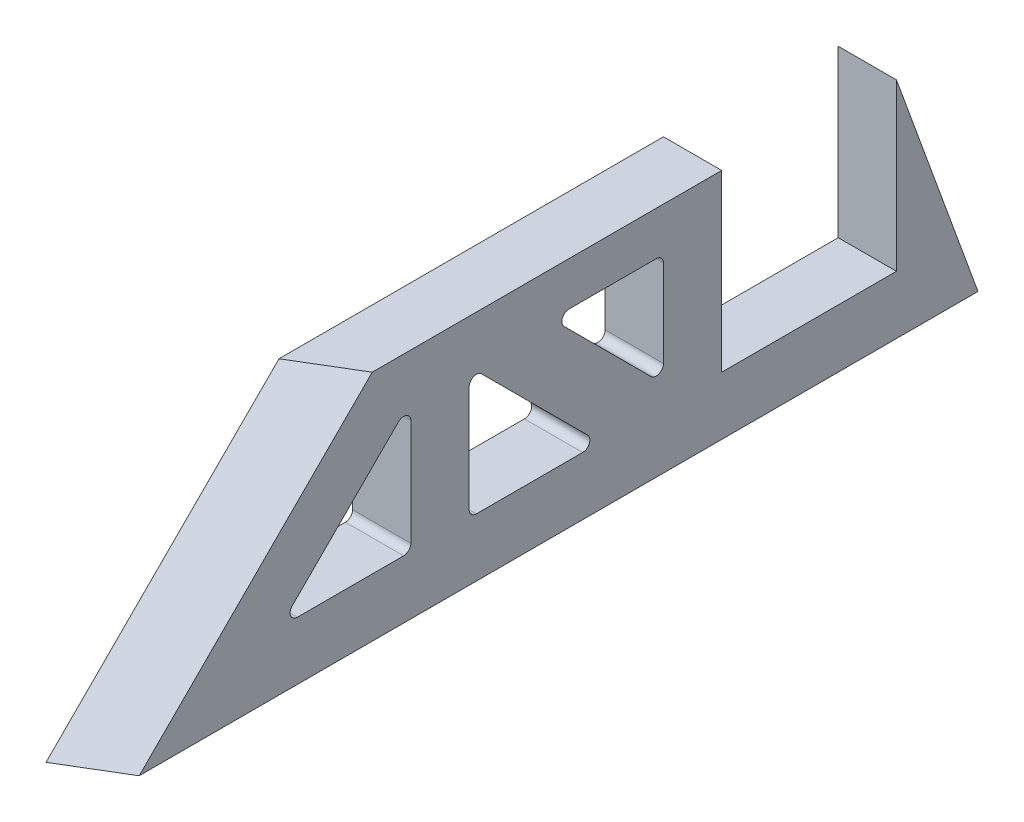
ISO-10303-21;
HEADER;
FILE_DESCRIPTION(('STEP AP214'),'2;1');
FILE_NAME('part.step','',(''),(''),'','','');
FILE_SCHEMA(('AUTOMOTIVE_DESIGN { 1 0 10303 214 1 1 1 1 }'));
ENDSEC;
DATA;
#1=APPLICATION_CONTEXT('core data for automotive mechanical design processes');
#2=APPLICATION_PROTOCOL_DEFINITION('international standard','automotive_design',2000,#1);
#3=PRODUCT_CONTEXT('',#1,'mechanical');
#4=PRODUCT('Part','Part','',(#3));
#5=PRODUCT_RELATED_PRODUCT_CATEGORY('part','',(#4));
#6=PRODUCT_DEFINITION_FORMATION('','',#4);
#7=PRODUCT_DEFINITION_CONTEXT('part definition',#1,'design');
#8=PRODUCT_DEFINITION('design','',#6,#7);
#9=PRODUCT_DEFINITION_SHAPE('','',#8);
#10=(LENGTH_UNIT() NAMED_UNIT(*) SI_UNIT(.MILLI.,.METRE.));
#11=(NAMED_UNIT(*) PLANE_ANGLE_UNIT() SI_UNIT($,.RADIAN.));
#12=(NAMED_UNIT(*) SI_UNIT($,.STERADIAN.) SOLID_ANGLE_UNIT());
#13=UNCERTAINTY_MEASURE_WITH_UNIT(LENGTH_MEASURE(1.E-05),#10,'distance_accuracy_value','');
#14=(GEOMETRIC_REPRESENTATION_CONTEXT(3) GLOBAL_UNCERTAINTY_ASSIGNED_CONTEXT((#13)) GLOBAL_UNIT_ASSIGNED_CONTEXT((#10,
#11,#12)) REPRESENTATION_CONTEXT('',''));
#15=CARTESIAN_POINT('',(0.,0.,0.));
#16=DIRECTION('',(0.,0.,1.));
#17=DIRECTION('',(1.,0.,0.));
#18=AXIS2_PLACEMENT_3D('',#15,#16,#17);
#19=CARTESIAN_POINT('',(12.7,12.7,-39.37));
#20=DIRECTION('',(0.,0.,1.));
#21=DIRECTION('',(0.,-1.,0.));
#22=AXIS2_PLACEMENT_3D('',#19,#20,#21);
#23=PLANE('',#22);
#24=DIRECTION('',(0.,1.,0.));
#25=VECTOR('',#24,1.);
#26=CARTESIAN_POINT('',(0.,12.7,-39.37));
#27=LINE('',#26,#25);
#28=CARTESIAN_POINT('',(0.,12.7,-39.37));
#29=VERTEX_POINT('',#28);
#30=CARTESIAN_POINT('',(0.,50.8,-39.37));
#31=VERTEX_POINT('',#30);
#32=EDGE_CURVE('E237',#29,#31,#27,.T.);
#33=ORIENTED_EDGE('',*,*,#32,.T.);
#34=DIRECTION('',(-1.,0.,0.));
#35=VECTOR('',#34,1.);
#36=CARTESIAN_POINT('',(12.7,50.8,-39.37));
#37=LINE('',#36,#35);
#38=CARTESIAN_POINT('',(12.7,50.8,-39.37));
#39=VERTEX_POINT('',#38);
#40=EDGE_CURVE('E261',#39,#31,#37,.T.);
#41=ORIENTED_EDGE('',*,*,#40,.F.);
#42=DIRECTION('',(0.,1.,0.));
#43=VECTOR('',#42,1.);
#44=CARTESIAN_POINT('',(12.7,12.7,-39.37));
#45=LINE('',#44,#43);
#46=CARTESIAN_POINT('',(12.7,12.7,-39.37));
#47=VERTEX_POINT('',#46);
#48=EDGE_CURVE('E229',#47,#39,#45,.T.);
#49=ORIENTED_EDGE('',*,*,#48,.F.);
#50=DIRECTION('',(-1.,0.,0.));
#51=VECTOR('',#50,1.);
#52=CARTESIAN_POINT('',(12.7,12.7,-39.37));
#53=LINE('',#52,#51);
#54=EDGE_CURVE('E236',#47,#29,#53,.T.);
#55=ORIENTED_EDGE('',*,*,#54,.T.);
#56=EDGE_LOOP('',(#33,#41,#49,#55));
#57=FACE_BOUND('',#56,.T.);
#58=ADVANCED_FACE('F33',(#57),#23,.F.);
#59=CARTESIAN_POINT('',(12.7,50.8,-39.37));
#60=DIRECTION('',(0.,-1.,0.));
#61=DIRECTION('',(0.,0.,-1.));
#62=AXIS2_PLACEMENT_3D('',#59,#60,#61);
#63=PLANE('',#62);
#64=DIRECTION('',(0.,0.,1.));
#65=VECTOR('',#64,1.);
#66=CARTESIAN_POINT('',(0.,50.8,-39.37));
#67=LINE('',#66,#65);
#68=CARTESIAN_POINT('',(0.,50.8,44.4499999999995));
#69=VERTEX_POINT('',#68);
#70=EDGE_CURVE('E240',#31,#69,#67,.T.);
#71=ORIENTED_EDGE('',*,*,#70,.T.);
#72=DIRECTION('',(0.857492925712544,0.,-0.514495755427527));
#73=VECTOR('',#72,1.);
#74=CARTESIAN_POINT('',(46.3176470588233,50.8,16.6594117647055));
#75=LINE('',#74,#73);
#76=CARTESIAN_POINT('',(12.7,50.8,36.8299999999995));
#77=VERTEX_POINT('',#76);
#78=EDGE_CURVE('E219',#69,#77,#75,.T.);
#79=ORIENTED_EDGE('',*,*,#78,.T.);
#80=DIRECTION('',(0.,0.,1.));
#81=VECTOR('',#80,1.);
#82=CARTESIAN_POINT('',(12.7,50.8,-39.37));
#83=LINE('',#82,#81);
#84=EDGE_CURVE('E218',#39,#77,#83,.T.);
#85=ORIENTED_EDGE('',*,*,#84,.F.);
#86=ORIENTED_EDGE('',*,*,#40,.T.);
#87=EDGE_LOOP('',(#71,#79,#85,#86));
#88=FACE_BOUND('',#87,.T.);
#89=ADVANCED_FACE('F389',(#88),#63,.F.);
#90=CARTESIAN_POINT('',(12.7,0.,95.25));
#91=DIRECTION('',(0.,1.,0.));
#92=DIRECTION('',(0.,0.,1.));
#93=AXIS2_PLACEMENT_3D('',#90,#91,#92);
#94=PLANE('',#93);
#95=DIRECTION('',(0.,0.,-1.));
#96=VECTOR('',#95,1.);
#97=CARTESIAN_POINT('',(12.7,0.,95.25));
#98=LINE('',#97,#96);
#99=CARTESIAN_POINT('',(12.7,0.,87.63));
#100=VERTEX_POINT('',#99);
#101=CARTESIAN_POINT('',(12.7,0.,-95.25));
#102=VERTEX_POINT('',#101);
#103=EDGE_CURVE('E215',#100,#102,#98,.T.);
#104=ORIENTED_EDGE('',*,*,#103,.F.);
#105=DIRECTION('',(0.857492925712544,0.,-0.514495755427527));
#106=VECTOR('',#105,1.);
#107=CARTESIAN_POINT('',(12.7,0.,87.63));
#108=LINE('',#107,#106);
#109=CARTESIAN_POINT('',(0.,0.,95.25));
#110=VERTEX_POINT('',#109);
#111=EDGE_CURVE('E200',#110,#100,#108,.T.);
#112=ORIENTED_EDGE('',*,*,#111,.F.);
#113=DIRECTION('',(0.,0.,-1.));
#114=VECTOR('',#113,1.);
#115=CARTESIAN_POINT('',(0.,0.,95.25));
#116=LINE('',#115,#114);
#117=CARTESIAN_POINT('',(0.,0.,-95.25));
#118=VERTEX_POINT('',#117);
#119=EDGE_CURVE('E244',#110,#118,#116,.T.);
#120=ORIENTED_EDGE('',*,*,#119,.T.);
#121=DIRECTION('',(-1.,0.,0.));
#122=VECTOR('',#121,1.);
#123=CARTESIAN_POINT('',(12.7,0.,-95.25));
#124=LINE('',#123,#122);
#125=EDGE_CURVE('E223',#102,#118,#124,.T.);
#126=ORIENTED_EDGE('',*,*,#125,.F.);
#127=EDGE_LOOP('',(#104,#112,#120,#126));
#128=FACE_BOUND('',#127,.T.);
#129=ADVANCED_FACE('F221',(#128),#94,.F.);
#130=CARTESIAN_POINT('',(12.7,0.,-95.25));
#131=DIRECTION('',(0.,-0.342020143325673,0.939692620785907));
#132=DIRECTION('',(0.,-0.939692620785907,-0.342020143325673));
#133=AXIS2_PLACEMENT_3D('',#130,#131,#132);
#134=PLANE('',#133);
#135=DIRECTION('',(0.,0.939692620785907,0.342020143325673));
#136=VECTOR('',#135,1.);
#137=CARTESIAN_POINT('',(0.,0.,-95.25));
#138=LINE('',#137,#136);
#139=CARTESIAN_POINT('',(0.,48.8501485179025,-77.47));
#140=VERTEX_POINT('',#139);
#141=EDGE_CURVE('E246',#118,#140,#138,.T.);
#142=ORIENTED_EDGE('',*,*,#141,.T.);
#143=DIRECTION('',(-1.,0.,0.));
#144=VECTOR('',#143,1.);
#145=CARTESIAN_POINT('',(12.7,48.8501485179025,-77.47));
#146=LINE('',#145,#144);
#147=CARTESIAN_POINT('',(12.7,48.8501485179025,-77.47));
#148=VERTEX_POINT('',#147);
#149=EDGE_CURVE('E257',#148,#140,#146,.T.);
#150=ORIENTED_EDGE('',*,*,#149,.F.);
#151=DIRECTION('',(0.,0.939692620785907,0.342020143325673));
#152=VECTOR('',#151,1.);
#153=CARTESIAN_POINT('',(12.7,0.,-95.25));
#154=LINE('',#153,#152);
#155=EDGE_CURVE('E225',#102,#148,#154,.T.);
#156=ORIENTED_EDGE('',*,*,#155,.F.);
#157=ORIENTED_EDGE('',*,*,#125,.T.);
#158=EDGE_LOOP('',(#142,#150,#156,#157));
#159=FACE_BOUND('',#158,.T.);
#160=ADVANCED_FACE('F393',(#159),#134,.F.);
#161=CARTESIAN_POINT('',(12.7,48.8501485179025,-77.47));
#162=DIRECTION('',(0.,0.,-1.));
#163=DIRECTION('',(-1.,0.,0.));
#164=AXIS2_PLACEMENT_3D('',#161,#162,#163);
#165=PLANE('',#164);
#166=DIRECTION('',(0.,-1.,0.));
#167=VECTOR('',#166,1.);
#168=CARTESIAN_POINT('',(0.,48.8501485179025,-77.47));
#169=LINE('',#168,#167);
#170=CARTESIAN_POINT('',(0.,12.7,-77.47));
#171=VERTEX_POINT('',#170);
#172=EDGE_CURVE('E248',#140,#171,#169,.T.);
#173=ORIENTED_EDGE('',*,*,#172,.T.);
#174=DIRECTION('',(-1.,0.,0.));
#175=VECTOR('',#174,1.);
#176=CARTESIAN_POINT('',(12.7,12.7,-77.47));
#177=LINE('',#176,#175);
#178=CARTESIAN_POINT('',(12.7,12.7,-77.47));
#179=VERTEX_POINT('',#178);
#180=EDGE_CURVE('E254',#179,#171,#177,.T.);
#181=ORIENTED_EDGE('',*,*,#180,.F.);
#182=DIRECTION('',(0.,-1.,0.));
#183=VECTOR('',#182,1.);
#184=CARTESIAN_POINT('',(12.7,48.8501485179025,-77.47));
#185=LINE('',#184,#183);
#186=EDGE_CURVE('E227',#148,#179,#185,.T.);
#187=ORIENTED_EDGE('',*,*,#186,.F.);
#188=ORIENTED_EDGE('',*,*,#149,.T.);
#189=EDGE_LOOP('',(#173,#181,#187,#188));
#190=FACE_BOUND('',#189,.T.);
#191=ADVANCED_FACE('F398',(#190),#165,.F.);
#192=CARTESIAN_POINT('',(12.7,12.7,-77.47));
#193=DIRECTION('',(0.,-1.,0.));
#194=DIRECTION('',(0.,0.,-1.));
#195=AXIS2_PLACEMENT_3D('',#192,#193,#194);
#196=PLANE('',#195);
#197=DIRECTION('',(0.,0.,1.));
#198=VECTOR('',#197,1.);
#199=CARTESIAN_POINT('',(0.,12.7,-77.47));
#200=LINE('',#199,#198);
#201=EDGE_CURVE('E250',#171,#29,#200,.T.);
#202=ORIENTED_EDGE('',*,*,#201,.T.);
#203=ORIENTED_EDGE('',*,*,#54,.F.);
#204=DIRECTION('',(0.,0.,1.));
#205=VECTOR('',#204,1.);
#206=CARTESIAN_POINT('',(12.7,12.7,-77.47));
#207=LINE('',#206,#205);
#208=EDGE_CURVE('E234',#179,#47,#207,.T.);
#209=ORIENTED_EDGE('',*,*,#208,.F.);
#210=ORIENTED_EDGE('',*,*,#180,.T.);
#211=EDGE_LOOP('',(#202,#203,#209,#210));
#212=FACE_BOUND('',#211,.T.);
#213=ADVANCED_FACE('F401',(#212),#196,.F.);
#214=CARTESIAN_POINT('',(12.7,0.,0.));
#215=DIRECTION('',(1.,0.,0.));
#216=DIRECTION('',(0.,0.,-1.));
#217=AXIS2_PLACEMENT_3D('',#214,#215,#216);
#218=PLANE('',#217);
#219=DIRECTION('',(0.,0.,-1.));
#220=VECTOR('',#219,1.);
#221=CARTESIAN_POINT('',(12.7,12.7,28.3944877578612));
#222=LINE('',#221,#220);
#223=CARTESIAN_POINT('',(12.7,12.7,53.1369237275939));
#224=VERTEX_POINT('',#223);
#225=CARTESIAN_POINT('',(12.7,12.7,29.9819877578612));
#226=VERTEX_POINT('',#225);
#227=EDGE_CURVE('E472',#224,#226,#222,.T.);
#228=ORIENTED_EDGE('',*,*,#227,.F.);
#229=CARTESIAN_POINT('',(12.7,14.2875,53.1369237275939));
#230=DIRECTION('',(1.,0.,0.));
#231=DIRECTION('',(0.,0.,-1.));
#232=AXIS2_PLACEMENT_3D('',#229,#230,#231);
#233=CIRCLE('',#232,1.5875);
#234=CARTESIAN_POINT('',(12.7,15.4100320151336,54.2594557427275));
#235=VERTEX_POINT('',#234);
#236=EDGE_CURVE('E312',#224,#235,#233,.F.);
#237=ORIENTED_EDGE('',*,*,#236,.T.);
#238=DIRECTION('',(0.,-0.707106781186548,0.707106781186547));
#239=VECTOR('',#238,1.);
#240=CARTESIAN_POINT('',(12.7,12.7,56.9694877578612));
#241=LINE('',#240,#239);
#242=CARTESIAN_POINT('',(12.7,38.5649679848663,31.1045197729948));
#243=VERTEX_POINT('',#242);
#244=EDGE_CURVE('E480',#243,#235,#241,.T.);
#245=ORIENTED_EDGE('',*,*,#244,.F.);
#246=CARTESIAN_POINT('',(12.7,37.4424359697327,29.9819877578612));
#247=DIRECTION('',(1.,0.,0.));
#248=DIRECTION('',(0.,0.,-1.));
#249=AXIS2_PLACEMENT_3D('',#246,#247,#248);
#250=CIRCLE('',#249,1.5875);
#251=CARTESIAN_POINT('',(12.7,37.4424359697327,28.3944877578612));
#252=VERTEX_POINT('',#251);
#253=EDGE_CURVE('E334',#243,#252,#250,.F.);
#254=ORIENTED_EDGE('',*,*,#253,.T.);
#255=DIRECTION('',(0.,1.,0.));
#256=VECTOR('',#255,1.);
#257=CARTESIAN_POINT('',(12.7,41.275,28.3944877578612));
#258=LINE('',#257,#256);
#259=CARTESIAN_POINT('',(12.7,14.2875,28.3944877578612));
#260=VERTEX_POINT('',#259);
#261=EDGE_CURVE('E477',#260,#252,#258,.T.);
#262=ORIENTED_EDGE('',*,*,#261,.F.);
#263=CARTESIAN_POINT('',(12.7,14.2875,29.9819877578612));
#264=DIRECTION('',(1.,0.,0.));
#265=DIRECTION('',(0.,0.,-1.));
#266=AXIS2_PLACEMENT_3D('',#263,#264,#265);
#267=CIRCLE('',#266,1.5875);
#268=EDGE_CURVE('E320',#260,#226,#267,.F.);
#269=ORIENTED_EDGE('',*,*,#268,.T.);
#270=EDGE_LOOP('',(#228,#237,#245,#254,#262,#269));
#271=FACE_BOUND('',#270,.T.);
#272=DIRECTION('',(0.,0.,1.));
#273=VECTOR('',#272,1.);
#274=CARTESIAN_POINT('',(12.7,41.275,-26.67));
#275=LINE('',#274,#273);
#276=CARTESIAN_POINT('',(12.7,41.275,-25.0825));
#277=VERTEX_POINT('',#276);
#278=CARTESIAN_POINT('',(12.7,41.275,-6.09858851454442));
#279=VERTEX_POINT('',#278);
#280=EDGE_CURVE('E489',#277,#279,#275,.T.);
#281=ORIENTED_EDGE('',*,*,#280,.F.);
#282=CARTESIAN_POINT('',(12.7,39.6875,-25.0825));
#283=DIRECTION('',(1.,0.,0.));
#284=DIRECTION('',(0.,0.,-1.));
#285=AXIS2_PLACEMENT_3D('',#282,#283,#284);
#286=CIRCLE('',#285,1.5875);
#287=CARTESIAN_POINT('',(12.7,39.6875,-26.67));
#288=VERTEX_POINT('',#287);
#289=EDGE_CURVE('E56',#277,#288,#286,.F.);
#290=ORIENTED_EDGE('',*,*,#289,.T.);
#291=DIRECTION('',(0.,1.,0.));
#292=VECTOR('',#291,1.);
#293=CARTESIAN_POINT('',(12.7,16.8710244842771,-26.67));
#294=LINE('',#293,#292);
#295=CARTESIAN_POINT('',(12.7,20.7035885145444,-26.67));
#296=VERTEX_POINT('',#295);
#297=EDGE_CURVE('E373',#296,#288,#294,.T.);
#298=ORIENTED_EDGE('',*,*,#297,.F.);
#299=CARTESIAN_POINT('',(12.7,20.7035885145444,-25.0825));
#300=DIRECTION('',(1.,0.,0.));
#301=DIRECTION('',(0.,0.,-1.));
#302=AXIS2_PLACEMENT_3D('',#299,#300,#301);
#303=CIRCLE('',#302,1.5875);
#304=CARTESIAN_POINT('',(12.7,19.5810564994108,-23.9599679848664));
#305=VERTEX_POINT('',#304);
#306=EDGE_CURVE('E316',#296,#305,#303,.F.);
#307=ORIENTED_EDGE('',*,*,#306,.T.);
#308=DIRECTION('',(0.,-0.707106781186547,-0.707106781186547));
#309=VECTOR('',#308,1.);
#310=CARTESIAN_POINT('',(12.7,41.275,-2.26602448427713));
#311=LINE('',#310,#309);
#312=CARTESIAN_POINT('',(12.7,38.5649679848664,-4.97605649941077));
#313=VERTEX_POINT('',#312);
#314=EDGE_CURVE('E491',#313,#305,#311,.T.);
#315=ORIENTED_EDGE('',*,*,#314,.F.);
#316=CARTESIAN_POINT('',(12.7,39.6875,-6.09858851454442));
#317=DIRECTION('',(1.,0.,0.));
#318=DIRECTION('',(0.,0.,-1.));
#319=AXIS2_PLACEMENT_3D('',#316,#317,#318);
#320=CIRCLE('',#319,1.5875);
#321=EDGE_CURVE('E48',#313,#279,#320,.F.);
#322=ORIENTED_EDGE('',*,*,#321,.T.);
#323=EDGE_LOOP('',(#281,#290,#298,#307,#315,#322));
#324=FACE_BOUND('',#323,.T.);
#325=DIRECTION('',(0.,0.,-1.));
#326=VECTOR('',#325,1.);
#327=CARTESIAN_POINT('',(12.7,12.7,-12.8805122421389));
#328=LINE('',#327,#326);
#329=CARTESIAN_POINT('',(12.7,12.7,14.1069877578612));
#330=VERTEX_POINT('',#329);
#331=CARTESIAN_POINT('',(12.7,12.7,-9.04794821187155));
#332=VERTEX_POINT('',#331);
#333=EDGE_CURVE('E353',#330,#332,#328,.T.);
#334=ORIENTED_EDGE('',*,*,#333,.F.);
#335=CARTESIAN_POINT('',(12.7,14.2875,14.1069877578612));
#336=DIRECTION('',(1.,0.,0.));
#337=DIRECTION('',(0.,0.,-1.));
#338=AXIS2_PLACEMENT_3D('',#335,#336,#337);
#339=CIRCLE('',#338,1.5875);
#340=CARTESIAN_POINT('',(12.7,14.2875,15.6944877578612));
#341=VERTEX_POINT('',#340);
#342=EDGE_CURVE('E308',#330,#341,#339,.F.);
#343=ORIENTED_EDGE('',*,*,#342,.T.);
#344=DIRECTION('',(0.,-1.,0.));
#345=VECTOR('',#344,1.);
#346=CARTESIAN_POINT('',(12.7,12.7,15.6944877578612));
#347=LINE('',#346,#345);
#348=CARTESIAN_POINT('',(12.7,37.4424359697327,15.6944877578612));
#349=VERTEX_POINT('',#348);
#350=EDGE_CURVE('E344',#349,#341,#347,.T.);
#351=ORIENTED_EDGE('',*,*,#350,.F.);
#352=CARTESIAN_POINT('',(12.7,37.4424359697327,14.1069877578612));
#353=DIRECTION('',(1.,0.,0.));
#354=DIRECTION('',(0.,0.,-1.));
#355=AXIS2_PLACEMENT_3D('',#352,#353,#354);
#356=CIRCLE('',#355,1.5875);
#357=CARTESIAN_POINT('',(12.7,38.5649679848663,12.9844557427275));
#358=VERTEX_POINT('',#357);
#359=EDGE_CURVE('E41',#349,#358,#356,.F.);
#360=ORIENTED_EDGE('',*,*,#359,.T.);
#361=DIRECTION('',(0.,0.707106781186547,0.707106781186548));
#362=VECTOR('',#361,1.);
#363=CARTESIAN_POINT('',(12.7,41.275,15.6944877578612));
#364=LINE('',#363,#362);
#365=CARTESIAN_POINT('',(12.7,15.4100320151336,-10.1704802270052));
#366=VERTEX_POINT('',#365);
#367=EDGE_CURVE('E342',#366,#358,#364,.T.);
#368=ORIENTED_EDGE('',*,*,#367,.F.);
#369=CARTESIAN_POINT('',(12.7,14.2875,-9.04794821187155));
#370=DIRECTION('',(1.,0.,0.));
#371=DIRECTION('',(0.,0.,-1.));
#372=AXIS2_PLACEMENT_3D('',#369,#370,#371);
#373=CIRCLE('',#372,1.5875);
#374=EDGE_CURVE('E324',#366,#332,#373,.F.);
#375=ORIENTED_EDGE('',*,*,#374,.T.);
#376=EDGE_LOOP('',(#334,#343,#351,#360,#368,#375));
#377=FACE_BOUND('',#376,.T.);
#378=DIRECTION('',(0.,-0.707106781186544,0.707106781186551));
#379=VECTOR('',#378,1.);
#380=CARTESIAN_POINT('',(12.7,120.65,-33.020000000001));
#381=LINE('',#380,#379);
#382=EDGE_CURVE('E203',#77,#100,#381,.T.);
#383=ORIENTED_EDGE('',*,*,#382,.T.);
#384=ORIENTED_EDGE('',*,*,#103,.T.);
#385=ORIENTED_EDGE('',*,*,#155,.T.);
#386=ORIENTED_EDGE('',*,*,#186,.T.);
#387=ORIENTED_EDGE('',*,*,#208,.T.);
#388=ORIENTED_EDGE('',*,*,#48,.T.);
#389=ORIENTED_EDGE('',*,*,#84,.T.);
#390=EDGE_LOOP('',(#383,#384,#385,#386,#387,#388,#389));
#391=FACE_BOUND('',#390,.T.);
#392=ADVANCED_FACE('F214',(#271,#324,#377,#391),#218,.T.);
#393=CARTESIAN_POINT('',(0.,0.,0.));
#394=DIRECTION('',(1.,0.,0.));
#395=DIRECTION('',(0.,0.,-1.));
#396=AXIS2_PLACEMENT_3D('',#393,#394,#395);
#397=PLANE('',#396);
#398=DIRECTION('',(0.,0.707106781186548,-0.707106781186548));
#399=VECTOR('',#398,1.);
#400=CARTESIAN_POINT('',(0.,12.7,56.9694877578612));
#401=LINE('',#400,#399);
#402=CARTESIAN_POINT('',(0.,15.4100320151336,54.2594557427275));
#403=VERTEX_POINT('',#402);
#404=CARTESIAN_POINT('',(0.,38.5649679848663,31.1045197729948));
#405=VERTEX_POINT('',#404);
#406=EDGE_CURVE('E380',#403,#405,#401,.T.);
#407=ORIENTED_EDGE('',*,*,#406,.F.);
#408=CARTESIAN_POINT('',(0.,14.2875,53.1369237275939));
#409=DIRECTION('',(1.,0.,0.));
#410=DIRECTION('',(0.,0.,-1.));
#411=AXIS2_PLACEMENT_3D('',#408,#409,#410);
#412=CIRCLE('',#411,1.5875);
#413=CARTESIAN_POINT('',(0.,12.7,53.1369237275939));
#414=VERTEX_POINT('',#413);
#415=EDGE_CURVE('E314',#403,#414,#412,.T.);
#416=ORIENTED_EDGE('',*,*,#415,.T.);
#417=DIRECTION('',(0.,0.,1.));
#418=VECTOR('',#417,1.);
#419=CARTESIAN_POINT('',(0.,12.7,28.3944877578612));
#420=LINE('',#419,#418);
#421=CARTESIAN_POINT('',(0.,12.7,29.9819877578612));
#422=VERTEX_POINT('',#421);
#423=EDGE_CURVE('E469',#422,#414,#420,.T.);
#424=ORIENTED_EDGE('',*,*,#423,.F.);
#425=CARTESIAN_POINT('',(0.,14.2875,29.9819877578612));
#426=DIRECTION('',(1.,0.,0.));
#427=DIRECTION('',(0.,0.,-1.));
#428=AXIS2_PLACEMENT_3D('',#425,#426,#427);
#429=CIRCLE('',#428,1.5875);
#430=CARTESIAN_POINT('',(0.,14.2875,28.3944877578612));
#431=VERTEX_POINT('',#430);
#432=EDGE_CURVE('E322',#422,#431,#429,.T.);
#433=ORIENTED_EDGE('',*,*,#432,.T.);
#434=DIRECTION('',(0.,-1.,0.));
#435=VECTOR('',#434,1.);
#436=CARTESIAN_POINT('',(0.,41.275,28.3944877578612));
#437=LINE('',#436,#435);
#438=CARTESIAN_POINT('',(0.,37.4424359697327,28.3944877578612));
#439=VERTEX_POINT('',#438);
#440=EDGE_CURVE('E210',#439,#431,#437,.T.);
#441=ORIENTED_EDGE('',*,*,#440,.F.);
#442=CARTESIAN_POINT('',(0.,37.4424359697327,29.9819877578612));
#443=DIRECTION('',(1.,0.,0.));
#444=DIRECTION('',(0.,0.,-1.));
#445=AXIS2_PLACEMENT_3D('',#442,#443,#444);
#446=CIRCLE('',#445,1.5875);
#447=EDGE_CURVE('E336',#439,#405,#446,.T.);
#448=ORIENTED_EDGE('',*,*,#447,.T.);
#449=EDGE_LOOP('',(#407,#416,#424,#433,#441,#448));
#450=FACE_BOUND('',#449,.T.);
#451=DIRECTION('',(0.,-1.,0.));
#452=VECTOR('',#451,1.);
#453=CARTESIAN_POINT('',(0.,16.8710244842771,-26.67));
#454=LINE('',#453,#452);
#455=CARTESIAN_POINT('',(0.,39.6875,-26.67));
#456=VERTEX_POINT('',#455);
#457=CARTESIAN_POINT('',(0.,20.7035885145444,-26.67));
#458=VERTEX_POINT('',#457);
#459=EDGE_CURVE('E483',#456,#458,#454,.T.);
#460=ORIENTED_EDGE('',*,*,#459,.F.);
#461=CARTESIAN_POINT('',(0.,39.6875,-25.0825));
#462=DIRECTION('',(1.,0.,0.));
#463=DIRECTION('',(0.,0.,-1.));
#464=AXIS2_PLACEMENT_3D('',#461,#462,#463);
#465=CIRCLE('',#464,1.5875);
#466=CARTESIAN_POINT('',(0.,41.275,-25.0825));
#467=VERTEX_POINT('',#466);
#468=EDGE_CURVE('E332',#456,#467,#465,.T.);
#469=ORIENTED_EDGE('',*,*,#468,.T.);
#470=DIRECTION('',(0.,0.,-1.));
#471=VECTOR('',#470,1.);
#472=CARTESIAN_POINT('',(0.,41.275,-26.67));
#473=LINE('',#472,#471);
#474=CARTESIAN_POINT('',(0.,41.275,-6.09858851454442));
#475=VERTEX_POINT('',#474);
#476=EDGE_CURVE('E486',#475,#467,#473,.T.);
#477=ORIENTED_EDGE('',*,*,#476,.F.);
#478=CARTESIAN_POINT('',(0.,39.6875,-6.09858851454442));
#479=DIRECTION('',(1.,0.,0.));
#480=DIRECTION('',(0.,0.,-1.));
#481=AXIS2_PLACEMENT_3D('',#478,#479,#480);
#482=CIRCLE('',#481,1.5875);
#483=CARTESIAN_POINT('',(0.,38.5649679848664,-4.97605649941077));
#484=VERTEX_POINT('',#483);
#485=EDGE_CURVE('E329',#475,#484,#482,.T.);
#486=ORIENTED_EDGE('',*,*,#485,.T.);
#487=DIRECTION('',(0.,0.707106781186548,0.707106781186548));
#488=VECTOR('',#487,1.);
#489=CARTESIAN_POINT('',(0.,41.275,-2.26602448427713));
#490=LINE('',#489,#488);
#491=CARTESIAN_POINT('',(0.,19.5810564994108,-23.9599679848664));
#492=VERTEX_POINT('',#491);
#493=EDGE_CURVE('E368',#492,#484,#490,.T.);
#494=ORIENTED_EDGE('',*,*,#493,.F.);
#495=CARTESIAN_POINT('',(0.,20.7035885145444,-25.0825));
#496=DIRECTION('',(1.,0.,0.));
#497=DIRECTION('',(0.,0.,-1.));
#498=AXIS2_PLACEMENT_3D('',#495,#496,#497);
#499=CIRCLE('',#498,1.5875);
#500=EDGE_CURVE('E318',#492,#458,#499,.T.);
#501=ORIENTED_EDGE('',*,*,#500,.T.);
#502=EDGE_LOOP('',(#460,#469,#477,#486,#494,#501));
#503=FACE_BOUND('',#502,.T.);
#504=DIRECTION('',(0.,1.,0.));
#505=VECTOR('',#504,1.);
#506=CARTESIAN_POINT('',(0.,12.7,15.6944877578612));
#507=LINE('',#506,#505);
#508=CARTESIAN_POINT('',(0.,14.2875,15.6944877578612));
#509=VERTEX_POINT('',#508);
#510=CARTESIAN_POINT('',(0.,37.4424359697327,15.6944877578612));
#511=VERTEX_POINT('',#510);
#512=EDGE_CURVE('E361',#509,#511,#507,.T.);
#513=ORIENTED_EDGE('',*,*,#512,.F.);
#514=CARTESIAN_POINT('',(0.,14.2875,14.1069877578612));
#515=DIRECTION('',(1.,0.,0.));
#516=DIRECTION('',(0.,0.,-1.));
#517=AXIS2_PLACEMENT_3D('',#514,#515,#516);
#518=CIRCLE('',#517,1.5875);
#519=CARTESIAN_POINT('',(0.,12.7,14.1069877578612));
#520=VERTEX_POINT('',#519);
#521=EDGE_CURVE('E310',#509,#520,#518,.T.);
#522=ORIENTED_EDGE('',*,*,#521,.T.);
#523=DIRECTION('',(0.,0.,1.));
#524=VECTOR('',#523,1.);
#525=CARTESIAN_POINT('',(0.,12.7,-12.8805122421389));
#526=LINE('',#525,#524);
#527=CARTESIAN_POINT('',(0.,12.7,-9.04794821187155));
#528=VERTEX_POINT('',#527);
#529=EDGE_CURVE('E367',#528,#520,#526,.T.);
#530=ORIENTED_EDGE('',*,*,#529,.F.);
#531=CARTESIAN_POINT('',(0.,14.2875,-9.04794821187155));
#532=DIRECTION('',(1.,0.,0.));
#533=DIRECTION('',(0.,0.,-1.));
#534=AXIS2_PLACEMENT_3D('',#531,#532,#533);
#535=CIRCLE('',#534,1.5875);
#536=CARTESIAN_POINT('',(0.,15.4100320151336,-10.1704802270052));
#537=VERTEX_POINT('',#536);
#538=EDGE_CURVE('E326',#528,#537,#535,.T.);
#539=ORIENTED_EDGE('',*,*,#538,.T.);
#540=DIRECTION('',(0.,-0.707106781186547,-0.707106781186548));
#541=VECTOR('',#540,1.);
#542=CARTESIAN_POINT('',(0.,41.275,15.6944877578612));
#543=LINE('',#542,#541);
#544=CARTESIAN_POINT('',(0.,38.5649679848663,12.9844557427275));
#545=VERTEX_POINT('',#544);
#546=EDGE_CURVE('E363',#545,#537,#543,.T.);
#547=ORIENTED_EDGE('',*,*,#546,.F.);
#548=CARTESIAN_POINT('',(0.,37.4424359697327,14.1069877578612));
#549=DIRECTION('',(1.,0.,0.));
#550=DIRECTION('',(0.,0.,-1.));
#551=AXIS2_PLACEMENT_3D('',#548,#549,#550);
#552=CIRCLE('',#551,1.5875);
#553=EDGE_CURVE('E11',#545,#511,#552,.T.);
#554=ORIENTED_EDGE('',*,*,#553,.T.);
#555=EDGE_LOOP('',(#513,#522,#530,#539,#547,#554));
#556=FACE_BOUND('',#555,.T.);
#557=ORIENTED_EDGE('',*,*,#32,.F.);
#558=ORIENTED_EDGE('',*,*,#201,.F.);
#559=ORIENTED_EDGE('',*,*,#172,.F.);
#560=ORIENTED_EDGE('',*,*,#141,.F.);
#561=ORIENTED_EDGE('',*,*,#119,.F.);
#562=DIRECTION('',(0.,-0.707106781186544,0.707106781186551));
#563=VECTOR('',#562,1.);
#564=CARTESIAN_POINT('',(0.,50.8,44.4499999999995));
#565=LINE('',#564,#563);
#566=EDGE_CURVE('E206',#69,#110,#565,.T.);
#567=ORIENTED_EDGE('',*,*,#566,.F.);
#568=ORIENTED_EDGE('',*,*,#70,.F.);
#569=EDGE_LOOP('',(#557,#558,#559,#560,#561,#567,#568));
#570=FACE_BOUND('',#569,.T.);
#571=ADVANCED_FACE('F359',(#450,#503,#556,#570),#397,.F.);
#572=CARTESIAN_POINT('',(12.7,120.65,-33.020000000001));
#573=DIRECTION('',(-0.39056673294247,-0.650944554904123,-0.650944554904116));
#574=DIRECTION('',(0.,0.707106781186544,-0.707106781186551));
#575=AXIS2_PLACEMENT_3D('',#572,#573,#574);
#576=PLANE('',#575);
#577=ORIENTED_EDGE('',*,*,#566,.T.);
#578=ORIENTED_EDGE('',*,*,#111,.T.);
#579=ORIENTED_EDGE('',*,*,#382,.F.);
#580=ORIENTED_EDGE('',*,*,#78,.F.);
#581=EDGE_LOOP('',(#577,#578,#579,#580));
#582=FACE_BOUND('',#581,.T.);
#583=ADVANCED_FACE('F202',(#582),#576,.F.);
#584=CARTESIAN_POINT('',(-0.000999999999999265,12.7,-12.8805122421389));
#585=DIRECTION('',(0.,-1.,0.));
#586=DIRECTION('',(0.,0.,-1.));
#587=AXIS2_PLACEMENT_3D('',#584,#585,#586);
#588=PLANE('',#587);
#589=ORIENTED_EDGE('',*,*,#529,.T.);
#590=DIRECTION('',(1.,0.,0.));
#591=VECTOR('',#590,1.);
#592=CARTESIAN_POINT('',(12.7,12.7,14.1069877578612));
#593=LINE('',#592,#591);
#594=EDGE_CURVE('E266',#520,#330,#593,.T.);
#595=ORIENTED_EDGE('',*,*,#594,.T.);
#596=ORIENTED_EDGE('',*,*,#333,.T.);
#597=DIRECTION('',(1.,0.,0.));
#598=VECTOR('',#597,1.);
#599=CARTESIAN_POINT('',(0.,12.7,-9.04794821187155));
#600=LINE('',#599,#598);
#601=EDGE_CURVE('E264',#332,#528,#600,.F.);
#602=ORIENTED_EDGE('',*,*,#601,.T.);
#603=EDGE_LOOP('',(#589,#595,#596,#602));
#604=FACE_BOUND('',#603,.T.);
#605=ADVANCED_FACE('F526',(#604),#588,.F.);
#606=CARTESIAN_POINT('',(-0.000999999999999265,12.7,15.6944877578612));
#607=DIRECTION('',(0.,0.,1.));
#608=DIRECTION('',(0.,-1.,0.));
#609=AXIS2_PLACEMENT_3D('',#606,#607,#608);
#610=PLANE('',#609);
#611=ORIENTED_EDGE('',*,*,#350,.T.);
#612=DIRECTION('',(1.,0.,0.));
#613=VECTOR('',#612,1.);
#614=CARTESIAN_POINT('',(0.,14.2875,15.6944877578612));
#615=LINE('',#614,#613);
#616=EDGE_CURVE('E272',#341,#509,#615,.F.);
#617=ORIENTED_EDGE('',*,*,#616,.T.);
#618=ORIENTED_EDGE('',*,*,#512,.T.);
#619=DIRECTION('',(1.,0.,0.));
#620=VECTOR('',#619,1.);
#621=CARTESIAN_POINT('',(12.7,37.4424359697327,15.6944877578612));
#622=LINE('',#621,#620);
#623=EDGE_CURVE('E269',#511,#349,#622,.T.);
#624=ORIENTED_EDGE('',*,*,#623,.T.);
#625=EDGE_LOOP('',(#611,#617,#618,#624));
#626=FACE_BOUND('',#625,.T.);
#627=ADVANCED_FACE('F365',(#626),#610,.F.);
#628=CARTESIAN_POINT('',(-0.000999999999999265,41.275,15.6944877578612));
#629=DIRECTION('',(0.,0.707106781186548,-0.707106781186547));
#630=DIRECTION('',(0.,0.707106781186547,0.707106781186548));
#631=AXIS2_PLACEMENT_3D('',#628,#629,#630);
#632=PLANE('',#631);
#633=ORIENTED_EDGE('',*,*,#546,.T.);
#634=DIRECTION('',(1.,0.,0.));
#635=VECTOR('',#634,1.);
#636=CARTESIAN_POINT('',(12.7,15.4100320151336,-10.1704802270052));
#637=LINE('',#636,#635);
#638=EDGE_CURVE('E301',#537,#366,#637,.T.);
#639=ORIENTED_EDGE('',*,*,#638,.T.);
#640=ORIENTED_EDGE('',*,*,#367,.T.);
#641=DIRECTION('',(1.,0.,0.));
#642=VECTOR('',#641,1.);
#643=CARTESIAN_POINT('',(0.,38.5649679848663,12.9844557427275));
#644=LINE('',#643,#642);
#645=EDGE_CURVE('E299',#358,#545,#644,.F.);
#646=ORIENTED_EDGE('',*,*,#645,.T.);
#647=EDGE_LOOP('',(#633,#639,#640,#646));
#648=FACE_BOUND('',#647,.T.);
#649=ADVANCED_FACE('F350',(#648),#632,.F.);
#650=CARTESIAN_POINT('',(-0.000999999999999265,41.275,-26.67));
#651=DIRECTION('',(0.,1.,0.));
#652=DIRECTION('',(0.,0.,1.));
#653=AXIS2_PLACEMENT_3D('',#650,#651,#652);
#654=PLANE('',#653);
#655=ORIENTED_EDGE('',*,*,#280,.T.);
#656=DIRECTION('',(1.,0.,0.));
#657=VECTOR('',#656,1.);
#658=CARTESIAN_POINT('',(0.,41.275,-6.09858851454442));
#659=LINE('',#658,#657);
#660=EDGE_CURVE('E306',#279,#475,#659,.F.);
#661=ORIENTED_EDGE('',*,*,#660,.T.);
#662=ORIENTED_EDGE('',*,*,#476,.T.);
#663=DIRECTION('',(1.,0.,0.));
#664=VECTOR('',#663,1.);
#665=CARTESIAN_POINT('',(12.7,41.275,-25.0825));
#666=LINE('',#665,#664);
#667=EDGE_CURVE('E304',#467,#277,#666,.T.);
#668=ORIENTED_EDGE('',*,*,#667,.T.);
#669=EDGE_LOOP('',(#655,#661,#662,#668));
#670=FACE_BOUND('',#669,.T.);
#671=ADVANCED_FACE('F503',(#670),#654,.F.);
#672=CARTESIAN_POINT('',(-0.000999999999999265,16.8710244842771,-26.67));
#673=DIRECTION('',(0.,0.,-1.));
#674=DIRECTION('',(0.,1.,0.));
#675=AXIS2_PLACEMENT_3D('',#672,#673,#674);
#676=PLANE('',#675);
#677=ORIENTED_EDGE('',*,*,#459,.T.);
#678=DIRECTION('',(1.,0.,0.));
#679=VECTOR('',#678,1.);
#680=CARTESIAN_POINT('',(12.7,20.7035885145444,-26.67));
#681=LINE('',#680,#679);
#682=EDGE_CURVE('E286',#458,#296,#681,.T.);
#683=ORIENTED_EDGE('',*,*,#682,.T.);
#684=ORIENTED_EDGE('',*,*,#297,.T.);
#685=DIRECTION('',(1.,0.,0.));
#686=VECTOR('',#685,1.);
#687=CARTESIAN_POINT('',(0.,39.6875,-26.67));
#688=LINE('',#687,#686);
#689=EDGE_CURVE('E284',#288,#456,#688,.F.);
#690=ORIENTED_EDGE('',*,*,#689,.T.);
#691=EDGE_LOOP('',(#677,#683,#684,#690));
#692=FACE_BOUND('',#691,.T.);
#693=ADVANCED_FACE('F496',(#692),#676,.F.);
#694=CARTESIAN_POINT('',(-0.000999999999999265,41.275,-2.26602448427713));
#695=DIRECTION('',(0.,-0.707106781186548,0.707106781186548));
#696=DIRECTION('',(0.,-0.707106781186548,-0.707106781186548));
#697=AXIS2_PLACEMENT_3D('',#694,#695,#696);
#698=PLANE('',#697);
#699=ORIENTED_EDGE('',*,*,#314,.T.);
#700=DIRECTION('',(1.,0.,0.));
#701=VECTOR('',#700,1.);
#702=CARTESIAN_POINT('',(0.,19.5810564994108,-23.9599679848664));
#703=LINE('',#702,#701);
#704=EDGE_CURVE('E292',#305,#492,#703,.F.);
#705=ORIENTED_EDGE('',*,*,#704,.T.);
#706=ORIENTED_EDGE('',*,*,#493,.T.);
#707=DIRECTION('',(1.,0.,0.));
#708=VECTOR('',#707,1.);
#709=CARTESIAN_POINT('',(12.7,38.5649679848664,-4.97605649941077));
#710=LINE('',#709,#708);
#711=EDGE_CURVE('E289',#484,#313,#710,.T.);
#712=ORIENTED_EDGE('',*,*,#711,.T.);
#713=EDGE_LOOP('',(#699,#705,#706,#712));
#714=FACE_BOUND('',#713,.T.);
#715=ADVANCED_FACE('F509',(#714),#698,.F.);
#716=CARTESIAN_POINT('',(-0.000999999999999265,12.7,28.3944877578612));
#717=DIRECTION('',(0.,-1.,0.));
#718=DIRECTION('',(0.,0.,-1.));
#719=AXIS2_PLACEMENT_3D('',#716,#717,#718);
#720=PLANE('',#719);
#721=ORIENTED_EDGE('',*,*,#423,.T.);
#722=DIRECTION('',(1.,0.,0.));
#723=VECTOR('',#722,1.);
#724=CARTESIAN_POINT('',(12.7,12.7,53.1369237275939));
#725=LINE('',#724,#723);
#726=EDGE_CURVE('E276',#414,#224,#725,.T.);
#727=ORIENTED_EDGE('',*,*,#726,.T.);
#728=ORIENTED_EDGE('',*,*,#227,.T.);
#729=DIRECTION('',(1.,0.,0.));
#730=VECTOR('',#729,1.);
#731=CARTESIAN_POINT('',(0.,12.7,29.9819877578612));
#732=LINE('',#731,#730);
#733=EDGE_CURVE('E274',#226,#422,#732,.F.);
#734=ORIENTED_EDGE('',*,*,#733,.T.);
#735=EDGE_LOOP('',(#721,#727,#728,#734));
#736=FACE_BOUND('',#735,.T.);
#737=ADVANCED_FACE('F512',(#736),#720,.F.);
#738=CARTESIAN_POINT('',(-0.000999999999999265,12.7,56.9694877578612));
#739=DIRECTION('',(0.,0.707106781186548,0.707106781186548));
#740=DIRECTION('',(0.,-0.707106781186548,0.707106781186548));
#741=AXIS2_PLACEMENT_3D('',#738,#739,#740);
#742=PLANE('',#741);
#743=ORIENTED_EDGE('',*,*,#244,.T.);
#744=DIRECTION('',(1.,0.,0.));
#745=VECTOR('',#744,1.);
#746=CARTESIAN_POINT('',(0.,15.4100320151336,54.2594557427275));
#747=LINE('',#746,#745);
#748=EDGE_CURVE('E282',#235,#403,#747,.F.);
#749=ORIENTED_EDGE('',*,*,#748,.T.);
#750=ORIENTED_EDGE('',*,*,#406,.T.);
#751=DIRECTION('',(1.,0.,0.));
#752=VECTOR('',#751,1.);
#753=CARTESIAN_POINT('',(12.7,38.5649679848663,31.1045197729948));
#754=LINE('',#753,#752);
#755=EDGE_CURVE('E279',#405,#243,#754,.T.);
#756=ORIENTED_EDGE('',*,*,#755,.T.);
#757=EDGE_LOOP('',(#743,#749,#750,#756));
#758=FACE_BOUND('',#757,.T.);
#759=ADVANCED_FACE('F466',(#758),#742,.F.);
#760=CARTESIAN_POINT('',(-0.000999999999999265,41.275,28.3944877578612));
#761=DIRECTION('',(0.,0.,-1.));
#762=DIRECTION('',(0.,1.,0.));
#763=AXIS2_PLACEMENT_3D('',#760,#761,#762);
#764=PLANE('',#763);
#765=ORIENTED_EDGE('',*,*,#440,.T.);
#766=DIRECTION('',(1.,0.,0.));
#767=VECTOR('',#766,1.);
#768=CARTESIAN_POINT('',(12.7,14.2875,28.3944877578612));
#769=LINE('',#768,#767);
#770=EDGE_CURVE('E296',#431,#260,#769,.T.);
#771=ORIENTED_EDGE('',*,*,#770,.T.);
#772=ORIENTED_EDGE('',*,*,#261,.T.);
#773=DIRECTION('',(1.,0.,0.));
#774=VECTOR('',#773,1.);
#775=CARTESIAN_POINT('',(0.,37.4424359697327,28.3944877578612));
#776=LINE('',#775,#774);
#777=EDGE_CURVE('E294',#252,#439,#776,.F.);
#778=ORIENTED_EDGE('',*,*,#777,.T.);
#779=EDGE_LOOP('',(#765,#771,#772,#778));
#780=FACE_BOUND('',#779,.T.);
#781=ADVANCED_FACE('F425',(#780),#764,.F.);
#782=CARTESIAN_POINT('',(-0.000999999999999265,14.2875,14.1069877578612));
#783=DIRECTION('',(-1.,0.,0.));
#784=DIRECTION('',(0.,0.,1.));
#785=AXIS2_PLACEMENT_3D('',#782,#783,#784);
#786=CYLINDRICAL_SURFACE('',#785,1.5875);
#787=ORIENTED_EDGE('',*,*,#521,.F.);
#788=ORIENTED_EDGE('',*,*,#616,.F.);
#789=ORIENTED_EDGE('',*,*,#342,.F.);
#790=ORIENTED_EDGE('',*,*,#594,.F.);
#791=EDGE_LOOP('',(#787,#788,#789,#790));
#792=FACE_BOUND('',#791,.T.);
#793=ADVANCED_FACE('F421',(#792),#786,.F.);
#794=CARTESIAN_POINT('',(-0.000999999999999265,14.2875,53.1369237275939));
#795=DIRECTION('',(-1.,0.,0.));
#796=DIRECTION('',(0.,0.,1.));
#797=AXIS2_PLACEMENT_3D('',#794,#795,#796);
#798=CYLINDRICAL_SURFACE('',#797,1.5875);
#799=ORIENTED_EDGE('',*,*,#415,.F.);
#800=ORIENTED_EDGE('',*,*,#748,.F.);
#801=ORIENTED_EDGE('',*,*,#236,.F.);
#802=ORIENTED_EDGE('',*,*,#726,.F.);
#803=EDGE_LOOP('',(#799,#800,#801,#802));
#804=FACE_BOUND('',#803,.T.);
#805=ADVANCED_FACE('F424',(#804),#798,.F.);
#806=CARTESIAN_POINT('',(-0.000999999999999265,20.7035885145444,-25.0825));
#807=DIRECTION('',(-1.,0.,0.));
#808=DIRECTION('',(0.,0.,1.));
#809=AXIS2_PLACEMENT_3D('',#806,#807,#808);
#810=CYLINDRICAL_SURFACE('',#809,1.5875);
#811=ORIENTED_EDGE('',*,*,#500,.F.);
#812=ORIENTED_EDGE('',*,*,#704,.F.);
#813=ORIENTED_EDGE('',*,*,#306,.F.);
#814=ORIENTED_EDGE('',*,*,#682,.F.);
#815=EDGE_LOOP('',(#811,#812,#813,#814));
#816=FACE_BOUND('',#815,.T.);
#817=ADVANCED_FACE('F429',(#816),#810,.F.);
#818=CARTESIAN_POINT('',(-0.000999999999999265,14.2875,29.9819877578612));
#819=DIRECTION('',(-1.,0.,0.));
#820=DIRECTION('',(0.,0.,1.));
#821=AXIS2_PLACEMENT_3D('',#818,#819,#820);
#822=CYLINDRICAL_SURFACE('',#821,1.5875);
#823=ORIENTED_EDGE('',*,*,#432,.F.);
#824=ORIENTED_EDGE('',*,*,#733,.F.);
#825=ORIENTED_EDGE('',*,*,#268,.F.);
#826=ORIENTED_EDGE('',*,*,#770,.F.);
#827=EDGE_LOOP('',(#823,#824,#825,#826));
#828=FACE_BOUND('',#827,.T.);
#829=ADVANCED_FACE('F433',(#828),#822,.F.);
#830=CARTESIAN_POINT('',(-0.000999999999999265,14.2875,-9.04794821187155));
#831=DIRECTION('',(-1.,0.,0.));
#832=DIRECTION('',(0.,0.,1.));
#833=AXIS2_PLACEMENT_3D('',#830,#831,#832);
#834=CYLINDRICAL_SURFACE('',#833,1.5875);
#835=ORIENTED_EDGE('',*,*,#538,.F.);
#836=ORIENTED_EDGE('',*,*,#601,.F.);
#837=ORIENTED_EDGE('',*,*,#374,.F.);
#838=ORIENTED_EDGE('',*,*,#638,.F.);
#839=EDGE_LOOP('',(#835,#836,#837,#838));
#840=FACE_BOUND('',#839,.T.);
#841=ADVANCED_FACE('F437',(#840),#834,.F.);
#842=CARTESIAN_POINT('',(-0.000999999999999265,39.6875,-6.09858851454442));
#843=DIRECTION('',(-1.,0.,0.));
#844=DIRECTION('',(0.,0.,1.));
#845=AXIS2_PLACEMENT_3D('',#842,#843,#844);
#846=CYLINDRICAL_SURFACE('',#845,1.5875);
#847=ORIENTED_EDGE('',*,*,#485,.F.);
#848=ORIENTED_EDGE('',*,*,#660,.F.);
#849=ORIENTED_EDGE('',*,*,#321,.F.);
#850=ORIENTED_EDGE('',*,*,#711,.F.);
#851=EDGE_LOOP('',(#847,#848,#849,#850));
#852=FACE_BOUND('',#851,.T.);
#853=ADVANCED_FACE('F441',(#852),#846,.F.);
#854=CARTESIAN_POINT('',(-0.000999999999999265,39.6875,-25.0825));
#855=DIRECTION('',(-1.,0.,0.));
#856=DIRECTION('',(0.,0.,1.));
#857=AXIS2_PLACEMENT_3D('',#854,#855,#856);
#858=CYLINDRICAL_SURFACE('',#857,1.5875);
#859=ORIENTED_EDGE('',*,*,#468,.F.);
#860=ORIENTED_EDGE('',*,*,#689,.F.);
#861=ORIENTED_EDGE('',*,*,#289,.F.);
#862=ORIENTED_EDGE('',*,*,#667,.F.);
#863=EDGE_LOOP('',(#859,#860,#861,#862));
#864=FACE_BOUND('',#863,.T.);
#865=ADVANCED_FACE('F445',(#864),#858,.F.);
#866=CARTESIAN_POINT('',(-0.000999999999999265,37.4424359697327,29.9819877578612));
#867=DIRECTION('',(-1.,0.,0.));
#868=DIRECTION('',(0.,0.,1.));
#869=AXIS2_PLACEMENT_3D('',#866,#867,#868);
#870=CYLINDRICAL_SURFACE('',#869,1.5875);
#871=ORIENTED_EDGE('',*,*,#447,.F.);
#872=ORIENTED_EDGE('',*,*,#777,.F.);
#873=ORIENTED_EDGE('',*,*,#253,.F.);
#874=ORIENTED_EDGE('',*,*,#755,.F.);
#875=EDGE_LOOP('',(#871,#872,#873,#874));
#876=FACE_BOUND('',#875,.T.);
#877=ADVANCED_FACE('F448',(#876),#870,.F.);
#878=CARTESIAN_POINT('',(-0.000999999999999265,37.4424359697327,14.1069877578612));
#879=DIRECTION('',(-1.,0.,0.));
#880=DIRECTION('',(0.,0.,1.));
#881=AXIS2_PLACEMENT_3D('',#878,#879,#880);
#882=CYLINDRICAL_SURFACE('',#881,1.5875);
#883=ORIENTED_EDGE('',*,*,#553,.F.);
#884=ORIENTED_EDGE('',*,*,#645,.F.);
#885=ORIENTED_EDGE('',*,*,#359,.F.);
#886=ORIENTED_EDGE('',*,*,#623,.F.);
#887=EDGE_LOOP('',(#883,#884,#885,#886));
#888=FACE_BOUND('',#887,.T.);
#889=ADVANCED_FACE('F35',(#888),#882,.F.);
#890=CLOSED_SHELL('',(#58,#89,#129,#160,#191,#213,#392,#571,#583,#605,#627,#649,#671,#693,#715,
#737,#759,#781,#793,#805,#817,#829,#841,#853,#865,#877,#889));
#891=MANIFOLD_SOLID_BREP('B2',#890);
#892=ADVANCED_BREP_SHAPE_REPRESENTATION('',(#18,#891),#14);
#893=SHAPE_DEFINITION_REPRESENTATION(#9,#892);
ENDSEC;
END-ISO-10303-21;
